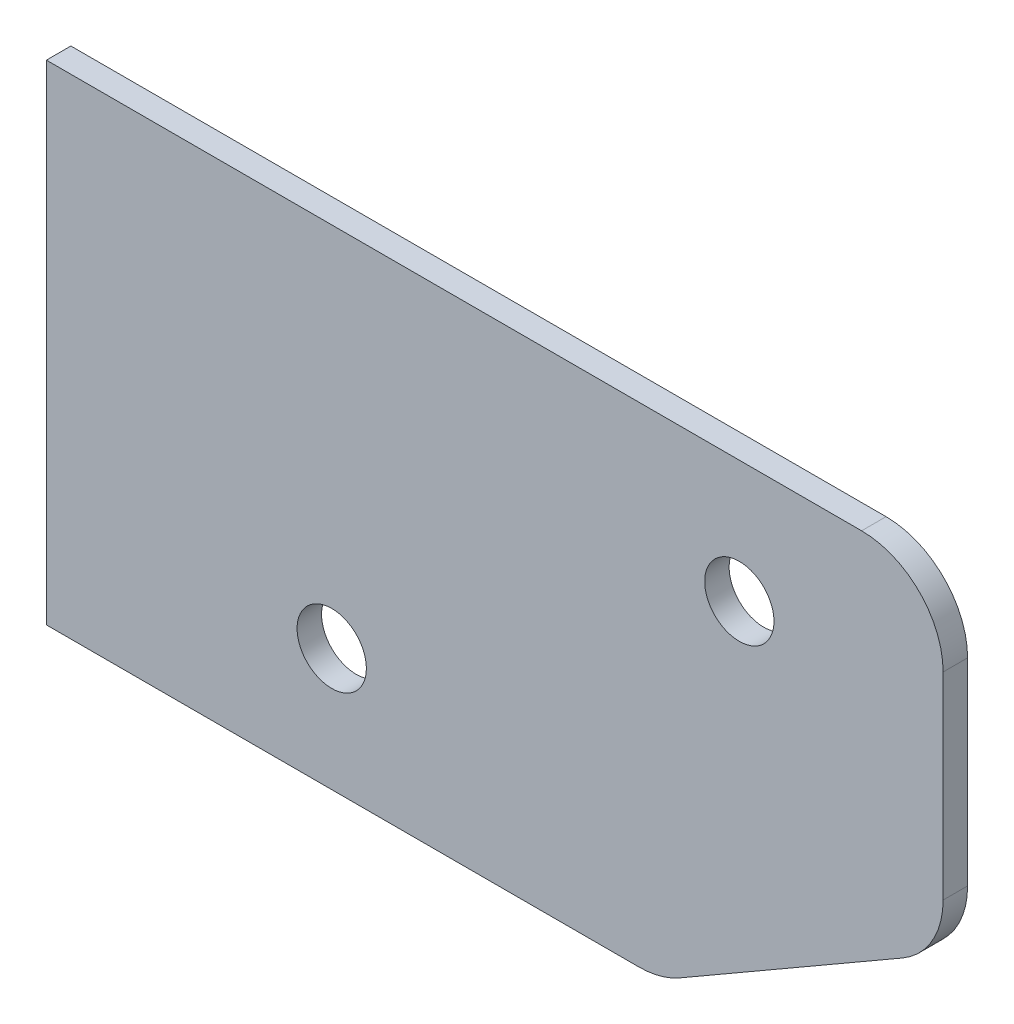
ISO-10303-21;
HEADER;
FILE_DESCRIPTION(('STEP AP214'),'2;1');
FILE_NAME('part.step','',(''),(''),'','','');
FILE_SCHEMA(('AUTOMOTIVE_DESIGN { 1 0 10303 214 1 1 1 1 }'));
ENDSEC;
DATA;
#1=APPLICATION_CONTEXT('core data for automotive mechanical design processes');
#2=APPLICATION_PROTOCOL_DEFINITION('international standard','automotive_design',2000,#1);
#3=PRODUCT_CONTEXT('',#1,'mechanical');
#4=PRODUCT('Part','Part','',(#3));
#5=PRODUCT_RELATED_PRODUCT_CATEGORY('part','',(#4));
#6=PRODUCT_DEFINITION_FORMATION('','',#4);
#7=PRODUCT_DEFINITION_CONTEXT('part definition',#1,'design');
#8=PRODUCT_DEFINITION('design','',#6,#7);
#9=PRODUCT_DEFINITION_SHAPE('','',#8);
#10=(LENGTH_UNIT() NAMED_UNIT(*) SI_UNIT(.MILLI.,.METRE.));
#11=(NAMED_UNIT(*) PLANE_ANGLE_UNIT() SI_UNIT($,.RADIAN.));
#12=(NAMED_UNIT(*) SI_UNIT($,.STERADIAN.) SOLID_ANGLE_UNIT());
#13=UNCERTAINTY_MEASURE_WITH_UNIT(LENGTH_MEASURE(1.E-05),#10,'distance_accuracy_value','');
#14=(GEOMETRIC_REPRESENTATION_CONTEXT(3) GLOBAL_UNCERTAINTY_ASSIGNED_CONTEXT((#13)) GLOBAL_UNIT_ASSIGNED_CONTEXT((#10,
#11,#12)) REPRESENTATION_CONTEXT('',''));
#15=CARTESIAN_POINT('',(0.,0.,0.));
#16=DIRECTION('',(0.,0.,1.));
#17=DIRECTION('',(1.,0.,0.));
#18=AXIS2_PLACEMENT_3D('',#15,#16,#17);
#19=CARTESIAN_POINT('',(75.3589838486223,0.,3.));
#20=DIRECTION('',(0.,1.,0.));
#21=DIRECTION('',(-1.,0.,0.));
#22=AXIS2_PLACEMENT_3D('',#19,#20,#21);
#23=PLANE('',#22);
#24=DIRECTION('',(1.,0.,0.));
#25=VECTOR('',#24,1.);
#26=CARTESIAN_POINT('',(75.3589838486223,0.,0.));
#27=LINE('',#26,#25);
#28=CARTESIAN_POINT('',(0.,0.,0.));
#29=VERTEX_POINT('',#28);
#30=CARTESIAN_POINT('',(72.6794919243111,0.,0.));
#31=VERTEX_POINT('',#30);
#32=EDGE_CURVE('E128',#29,#31,#27,.T.);
#33=ORIENTED_EDGE('',*,*,#32,.T.);
#34=DIRECTION('',(0.,0.,-1.));
#35=VECTOR('',#34,1.);
#36=CARTESIAN_POINT('',(72.6794919243111,0.,3.));
#37=LINE('',#36,#35);
#38=CARTESIAN_POINT('',(72.6794919243111,0.,3.));
#39=VERTEX_POINT('',#38);
#40=EDGE_CURVE('E11',#31,#39,#37,.F.);
#41=ORIENTED_EDGE('',*,*,#40,.T.);
#42=DIRECTION('',(1.,0.,0.));
#43=VECTOR('',#42,1.);
#44=CARTESIAN_POINT('',(75.3589838486223,0.,3.));
#45=LINE('',#44,#43);
#46=CARTESIAN_POINT('',(0.,0.,3.));
#47=VERTEX_POINT('',#46);
#48=EDGE_CURVE('E139',#47,#39,#45,.T.);
#49=ORIENTED_EDGE('',*,*,#48,.F.);
#50=DIRECTION('',(0.,0.,-1.));
#51=VECTOR('',#50,1.);
#52=CARTESIAN_POINT('',(0.,0.,3.));
#53=LINE('',#52,#51);
#54=EDGE_CURVE('E119',#47,#29,#53,.T.);
#55=ORIENTED_EDGE('',*,*,#54,.T.);
#56=EDGE_LOOP('',(#33,#41,#49,#55));
#57=FACE_BOUND('',#56,.T.);
#58=ADVANCED_FACE('F34',(#57),#23,.F.);
#59=CARTESIAN_POINT('',(110.,20.,3.00000000000003));
#60=DIRECTION('',(-0.499999999999998,0.86602540378444,0.));
#61=DIRECTION('',(-0.86602540378444,-0.499999999999998,0.));
#62=AXIS2_PLACEMENT_3D('',#59,#60,#61);
#63=PLANE('',#62);
#64=DIRECTION('',(0.86602540378444,0.499999999999998,0.));
#65=VECTOR('',#64,1.);
#66=CARTESIAN_POINT('',(110.,20.,0.));
#67=LINE('',#66,#65);
#68=CARTESIAN_POINT('',(77.679491924311,1.33974596215558,0.));
#69=VERTEX_POINT('',#68);
#70=CARTESIAN_POINT('',(105.,17.1132486540518,0.));
#71=VERTEX_POINT('',#70);
#72=EDGE_CURVE('E131',#69,#71,#67,.T.);
#73=ORIENTED_EDGE('',*,*,#72,.T.);
#74=DIRECTION('',(0.,0.,-1.));
#75=VECTOR('',#74,1.);
#76=CARTESIAN_POINT('',(105.,17.1132486540518,3.00000000000003));
#77=LINE('',#76,#75);
#78=CARTESIAN_POINT('',(105.,17.1132486540518,3.00000000000003));
#79=VERTEX_POINT('',#78);
#80=EDGE_CURVE('E42',#71,#79,#77,.F.);
#81=ORIENTED_EDGE('',*,*,#80,.T.);
#82=DIRECTION('',(0.86602540378444,0.499999999999998,0.));
#83=VECTOR('',#82,1.);
#84=CARTESIAN_POINT('',(110.,20.,3.00000000000003));
#85=LINE('',#84,#83);
#86=CARTESIAN_POINT('',(77.679491924311,1.33974596215558,3.));
#87=VERTEX_POINT('',#86);
#88=EDGE_CURVE('E162',#87,#79,#85,.T.);
#89=ORIENTED_EDGE('',*,*,#88,.F.);
#90=DIRECTION('',(0.,0.,-1.));
#91=VECTOR('',#90,1.);
#92=CARTESIAN_POINT('',(77.679491924311,1.33974596215558,3.));
#93=LINE('',#92,#91);
#94=EDGE_CURVE('E157',#87,#69,#93,.T.);
#95=ORIENTED_EDGE('',*,*,#94,.T.);
#96=EDGE_LOOP('',(#73,#81,#89,#95));
#97=FACE_BOUND('',#96,.T.);
#98=ADVANCED_FACE('F161',(#97),#63,.F.);
#99=CARTESIAN_POINT('',(110.,60.0000000000001,3.00000000000003));
#100=DIRECTION('',(-1.,0.,0.));
#101=DIRECTION('',(0.,-1.,0.));
#102=AXIS2_PLACEMENT_3D('',#99,#100,#101);
#103=PLANE('',#102);
#104=DIRECTION('',(0.,1.,0.));
#105=VECTOR('',#104,1.);
#106=CARTESIAN_POINT('',(110.,60.0000000000001,0.));
#107=LINE('',#106,#105);
#108=CARTESIAN_POINT('',(110.,25.7735026918963,0.));
#109=VERTEX_POINT('',#108);
#110=CARTESIAN_POINT('',(110.,50.,0.));
#111=VERTEX_POINT('',#110);
#112=EDGE_CURVE('E134',#109,#111,#107,.T.);
#113=ORIENTED_EDGE('',*,*,#112,.T.);
#114=DIRECTION('',(0.,0.,-1.));
#115=VECTOR('',#114,1.);
#116=CARTESIAN_POINT('',(110.,50.,3.00000000000003));
#117=LINE('',#116,#115);
#118=CARTESIAN_POINT('',(110.,50.,3.00000000000003));
#119=VERTEX_POINT('',#118);
#120=EDGE_CURVE('E151',#111,#119,#117,.F.);
#121=ORIENTED_EDGE('',*,*,#120,.T.);
#122=DIRECTION('',(0.,1.,0.));
#123=VECTOR('',#122,1.);
#124=CARTESIAN_POINT('',(110.,60.0000000000001,3.00000000000003));
#125=LINE('',#124,#123);
#126=CARTESIAN_POINT('',(110.,25.7735026918963,3.00000000000003));
#127=VERTEX_POINT('',#126);
#128=EDGE_CURVE('E109',#127,#119,#125,.T.);
#129=ORIENTED_EDGE('',*,*,#128,.F.);
#130=DIRECTION('',(0.,0.,-1.));
#131=VECTOR('',#130,1.);
#132=CARTESIAN_POINT('',(110.,25.7735026918963,3.00000000000003));
#133=LINE('',#132,#131);
#134=EDGE_CURVE('E148',#127,#109,#133,.T.);
#135=ORIENTED_EDGE('',*,*,#134,.T.);
#136=EDGE_LOOP('',(#113,#121,#129,#135));
#137=FACE_BOUND('',#136,.T.);
#138=ADVANCED_FACE('F174',(#137),#103,.F.);
#139=CARTESIAN_POINT('',(0.,60.0000000000001,3.));
#140=DIRECTION('',(0.,-1.,0.));
#141=DIRECTION('',(0.,0.,-1.));
#142=AXIS2_PLACEMENT_3D('',#139,#140,#141);
#143=PLANE('',#142);
#144=DIRECTION('',(-1.,0.,0.));
#145=VECTOR('',#144,1.);
#146=CARTESIAN_POINT('',(0.,60.0000000000001,3.));
#147=LINE('',#146,#145);
#148=CARTESIAN_POINT('',(100.,60.0000000000001,3.00000000000003));
#149=VERTEX_POINT('',#148);
#150=CARTESIAN_POINT('',(0.,60.0000000000001,3.));
#151=VERTEX_POINT('',#150);
#152=EDGE_CURVE('E97',#149,#151,#147,.T.);
#153=ORIENTED_EDGE('',*,*,#152,.F.);
#154=DIRECTION('',(0.,0.,-1.));
#155=VECTOR('',#154,1.);
#156=CARTESIAN_POINT('',(100.,60.0000000000001,3.00000000000003));
#157=LINE('',#156,#155);
#158=CARTESIAN_POINT('',(100.,60.0000000000001,0.));
#159=VERTEX_POINT('',#158);
#160=EDGE_CURVE('E118',#149,#159,#157,.T.);
#161=ORIENTED_EDGE('',*,*,#160,.T.);
#162=DIRECTION('',(-1.,0.,0.));
#163=VECTOR('',#162,1.);
#164=CARTESIAN_POINT('',(0.,60.0000000000001,0.));
#165=LINE('',#164,#163);
#166=CARTESIAN_POINT('',(0.,60.0000000000001,0.));
#167=VERTEX_POINT('',#166);
#168=EDGE_CURVE('E115',#159,#167,#165,.T.);
#169=ORIENTED_EDGE('',*,*,#168,.T.);
#170=DIRECTION('',(0.,0.,-1.));
#171=VECTOR('',#170,1.);
#172=CARTESIAN_POINT('',(0.,60.0000000000001,3.));
#173=LINE('',#172,#171);
#174=EDGE_CURVE('E112',#151,#167,#173,.T.);
#175=ORIENTED_EDGE('',*,*,#174,.F.);
#176=EDGE_LOOP('',(#153,#161,#169,#175));
#177=FACE_BOUND('',#176,.T.);
#178=ADVANCED_FACE('F113',(#177),#143,.F.);
#179=CARTESIAN_POINT('',(0.,0.,3.));
#180=DIRECTION('',(1.,0.,0.));
#181=DIRECTION('',(0.,0.,-1.));
#182=AXIS2_PLACEMENT_3D('',#179,#180,#181);
#183=PLANE('',#182);
#184=DIRECTION('',(0.,-1.,0.));
#185=VECTOR('',#184,1.);
#186=CARTESIAN_POINT('',(0.,0.,0.));
#187=LINE('',#186,#185);
#188=EDGE_CURVE('E138',#167,#29,#187,.T.);
#189=ORIENTED_EDGE('',*,*,#188,.T.);
#190=ORIENTED_EDGE('',*,*,#54,.F.);
#191=DIRECTION('',(0.,-1.,0.));
#192=VECTOR('',#191,1.);
#193=CARTESIAN_POINT('',(0.,0.,3.));
#194=LINE('',#193,#192);
#195=EDGE_CURVE('E102',#151,#47,#194,.T.);
#196=ORIENTED_EDGE('',*,*,#195,.F.);
#197=ORIENTED_EDGE('',*,*,#174,.T.);
#198=EDGE_LOOP('',(#189,#190,#196,#197));
#199=FACE_BOUND('',#198,.T.);
#200=ADVANCED_FACE('F121',(#199),#183,.F.);
#201=CARTESIAN_POINT('',(0.,0.,3.));
#202=DIRECTION('',(0.,0.,-1.));
#203=DIRECTION('',(-1.,0.,0.));
#204=AXIS2_PLACEMENT_3D('',#201,#202,#203);
#205=PLANE('',#204);
#206=CARTESIAN_POINT('',(85.,45.,3.));
#207=DIRECTION('',(0.,0.,1.));
#208=DIRECTION('',(1.,0.,0.));
#209=AXIS2_PLACEMENT_3D('',#206,#207,#208);
#210=CIRCLE('',#209,4.25000000000001);
#211=CARTESIAN_POINT('',(89.25,45.,3.));
#212=VERTEX_POINT('',#211);
#213=EDGE_CURVE('E185',#212,#212,#210,.T.);
#214=ORIENTED_EDGE('',*,*,#213,.F.);
#215=EDGE_LOOP('',(#214));
#216=FACE_BOUND('',#215,.T.);
#217=CARTESIAN_POINT('',(35.,15.,3.));
#218=DIRECTION('',(0.,0.,1.));
#219=DIRECTION('',(1.,0.,0.));
#220=AXIS2_PLACEMENT_3D('',#217,#218,#219);
#221=CIRCLE('',#220,4.25);
#222=CARTESIAN_POINT('',(39.25,15.,3.));
#223=VERTEX_POINT('',#222);
#224=EDGE_CURVE('E179',#223,#223,#221,.T.);
#225=ORIENTED_EDGE('',*,*,#224,.F.);
#226=EDGE_LOOP('',(#225));
#227=FACE_BOUND('',#226,.T.);
#228=ORIENTED_EDGE('',*,*,#128,.T.);
#229=CARTESIAN_POINT('',(100.,50.,3.00000000000003));
#230=DIRECTION('',(0.,0.,-1.));
#231=DIRECTION('',(-1.,0.,0.));
#232=AXIS2_PLACEMENT_3D('',#229,#230,#231);
#233=CIRCLE('',#232,10.);
#234=EDGE_CURVE('E105',#119,#149,#233,.F.);
#235=ORIENTED_EDGE('',*,*,#234,.T.);
#236=ORIENTED_EDGE('',*,*,#152,.T.);
#237=ORIENTED_EDGE('',*,*,#195,.T.);
#238=ORIENTED_EDGE('',*,*,#48,.T.);
#239=CARTESIAN_POINT('',(72.6794919243111,10.,3.));
#240=DIRECTION('',(0.,0.,-1.));
#241=DIRECTION('',(-1.,0.,0.));
#242=AXIS2_PLACEMENT_3D('',#239,#240,#241);
#243=CIRCLE('',#242,10.);
#244=EDGE_CURVE('E55',#39,#87,#243,.F.);
#245=ORIENTED_EDGE('',*,*,#244,.T.);
#246=ORIENTED_EDGE('',*,*,#88,.T.);
#247=CARTESIAN_POINT('',(100.,25.7735026918963,3.00000000000003));
#248=DIRECTION('',(0.,0.,-1.));
#249=DIRECTION('',(-1.,0.,0.));
#250=AXIS2_PLACEMENT_3D('',#247,#248,#249);
#251=CIRCLE('',#250,10.);
#252=EDGE_CURVE('E154',#79,#127,#251,.F.);
#253=ORIENTED_EDGE('',*,*,#252,.T.);
#254=EDGE_LOOP('',(#228,#235,#236,#237,#238,#245,#246,#253));
#255=FACE_BOUND('',#254,.T.);
#256=ADVANCED_FACE('F100',(#216,#227,#255),#205,.F.);
#257=CARTESIAN_POINT('',(0.,0.,0.));
#258=DIRECTION('',(0.,0.,-1.));
#259=DIRECTION('',(-1.,0.,0.));
#260=AXIS2_PLACEMENT_3D('',#257,#258,#259);
#261=PLANE('',#260);
#262=CARTESIAN_POINT('',(85.,45.,0.));
#263=DIRECTION('',(0.,0.,1.));
#264=DIRECTION('',(1.,0.,0.));
#265=AXIS2_PLACEMENT_3D('',#262,#263,#264);
#266=CIRCLE('',#265,4.25000000000001);
#267=CARTESIAN_POINT('',(89.25,45.,0.));
#268=VERTEX_POINT('',#267);
#269=EDGE_CURVE('E182',#268,#268,#266,.T.);
#270=ORIENTED_EDGE('',*,*,#269,.T.);
#271=EDGE_LOOP('',(#270));
#272=FACE_BOUND('',#271,.T.);
#273=CARTESIAN_POINT('',(35.,15.,0.));
#274=DIRECTION('',(0.,0.,1.));
#275=DIRECTION('',(1.,0.,0.));
#276=AXIS2_PLACEMENT_3D('',#273,#274,#275);
#277=CIRCLE('',#276,4.25);
#278=CARTESIAN_POINT('',(39.25,15.,0.));
#279=VERTEX_POINT('',#278);
#280=EDGE_CURVE('E132',#279,#279,#277,.T.);
#281=ORIENTED_EDGE('',*,*,#280,.T.);
#282=EDGE_LOOP('',(#281));
#283=FACE_BOUND('',#282,.T.);
#284=ORIENTED_EDGE('',*,*,#168,.F.);
#285=CARTESIAN_POINT('',(100.,50.,0.));
#286=DIRECTION('',(0.,0.,-1.));
#287=DIRECTION('',(-1.,0.,0.));
#288=AXIS2_PLACEMENT_3D('',#285,#286,#287);
#289=CIRCLE('',#288,10.);
#290=EDGE_CURVE('E146',#159,#111,#289,.T.);
#291=ORIENTED_EDGE('',*,*,#290,.T.);
#292=ORIENTED_EDGE('',*,*,#112,.F.);
#293=CARTESIAN_POINT('',(100.,25.7735026918963,0.));
#294=DIRECTION('',(0.,0.,-1.));
#295=DIRECTION('',(-1.,0.,0.));
#296=AXIS2_PLACEMENT_3D('',#293,#294,#295);
#297=CIRCLE('',#296,10.);
#298=EDGE_CURVE('E144',#109,#71,#297,.T.);
#299=ORIENTED_EDGE('',*,*,#298,.T.);
#300=ORIENTED_EDGE('',*,*,#72,.F.);
#301=CARTESIAN_POINT('',(72.6794919243111,10.,0.));
#302=DIRECTION('',(0.,0.,-1.));
#303=DIRECTION('',(-1.,0.,0.));
#304=AXIS2_PLACEMENT_3D('',#301,#302,#303);
#305=CIRCLE('',#304,10.);
#306=EDGE_CURVE('E142',#69,#31,#305,.T.);
#307=ORIENTED_EDGE('',*,*,#306,.T.);
#308=ORIENTED_EDGE('',*,*,#32,.F.);
#309=ORIENTED_EDGE('',*,*,#188,.F.);
#310=EDGE_LOOP('',(#284,#291,#292,#299,#300,#307,#308,#309));
#311=FACE_BOUND('',#310,.T.);
#312=ADVANCED_FACE('F165',(#272,#283,#311),#261,.T.);
#313=CARTESIAN_POINT('',(100.,50.,3.00000000000003));
#314=DIRECTION('',(0.,0.,-1.));
#315=DIRECTION('',(-1.,0.,0.));
#316=AXIS2_PLACEMENT_3D('',#313,#314,#315);
#317=CYLINDRICAL_SURFACE('',#316,10.);
#318=ORIENTED_EDGE('',*,*,#234,.F.);
#319=ORIENTED_EDGE('',*,*,#120,.F.);
#320=ORIENTED_EDGE('',*,*,#290,.F.);
#321=ORIENTED_EDGE('',*,*,#160,.F.);
#322=EDGE_LOOP('',(#318,#319,#320,#321));
#323=FACE_BOUND('',#322,.T.);
#324=ADVANCED_FACE('F221',(#323),#317,.T.);
#325=CARTESIAN_POINT('',(100.,25.7735026918963,3.00000000000003));
#326=DIRECTION('',(0.,0.,-1.));
#327=DIRECTION('',(-1.,0.,0.));
#328=AXIS2_PLACEMENT_3D('',#325,#326,#327);
#329=CYLINDRICAL_SURFACE('',#328,10.);
#330=ORIENTED_EDGE('',*,*,#252,.F.);
#331=ORIENTED_EDGE('',*,*,#80,.F.);
#332=ORIENTED_EDGE('',*,*,#298,.F.);
#333=ORIENTED_EDGE('',*,*,#134,.F.);
#334=EDGE_LOOP('',(#330,#331,#332,#333));
#335=FACE_BOUND('',#334,.T.);
#336=ADVANCED_FACE('F171',(#335),#329,.T.);
#337=CARTESIAN_POINT('',(72.6794919243111,10.,3.));
#338=DIRECTION('',(0.,0.,-1.));
#339=DIRECTION('',(-1.,0.,0.));
#340=AXIS2_PLACEMENT_3D('',#337,#338,#339);
#341=CYLINDRICAL_SURFACE('',#340,10.);
#342=ORIENTED_EDGE('',*,*,#244,.F.);
#343=ORIENTED_EDGE('',*,*,#40,.F.);
#344=ORIENTED_EDGE('',*,*,#306,.F.);
#345=ORIENTED_EDGE('',*,*,#94,.F.);
#346=EDGE_LOOP('',(#342,#343,#344,#345));
#347=FACE_BOUND('',#346,.T.);
#348=ADVANCED_FACE('F36',(#347),#341,.T.);
#349=CARTESIAN_POINT('',(35.,15.,0.));
#350=DIRECTION('',(0.,0.,1.));
#351=DIRECTION('',(1.,0.,0.));
#352=AXIS2_PLACEMENT_3D('',#349,#350,#351);
#353=CYLINDRICAL_SURFACE('',#352,4.25);
#354=ORIENTED_EDGE('',*,*,#280,.F.);
#355=EDGE_LOOP('',(#354));
#356=FACE_BOUND('',#355,.T.);
#357=ORIENTED_EDGE('',*,*,#224,.T.);
#358=EDGE_LOOP('',(#357));
#359=FACE_BOUND('',#358,.T.);
#360=ADVANCED_FACE('F196',(#356,#359),#353,.F.);
#361=CARTESIAN_POINT('',(85.,45.,0.));
#362=DIRECTION('',(0.,0.,1.));
#363=DIRECTION('',(1.,0.,0.));
#364=AXIS2_PLACEMENT_3D('',#361,#362,#363);
#365=CYLINDRICAL_SURFACE('',#364,4.25000000000001);
#366=ORIENTED_EDGE('',*,*,#269,.F.);
#367=EDGE_LOOP('',(#366));
#368=FACE_BOUND('',#367,.T.);
#369=ORIENTED_EDGE('',*,*,#213,.T.);
#370=EDGE_LOOP('',(#369));
#371=FACE_BOUND('',#370,.T.);
#372=ADVANCED_FACE('F193',(#368,#371),#365,.F.);
#373=CLOSED_SHELL('',(#58,#98,#138,#178,#200,#256,#312,#324,#336,#348,#360,#372));
#374=MANIFOLD_SOLID_BREP('B2',#373);
#375=ADVANCED_BREP_SHAPE_REPRESENTATION('',(#18,#374),#14);
#376=SHAPE_DEFINITION_REPRESENTATION(#9,#375);
ENDSEC;
END-ISO-10303-21;
